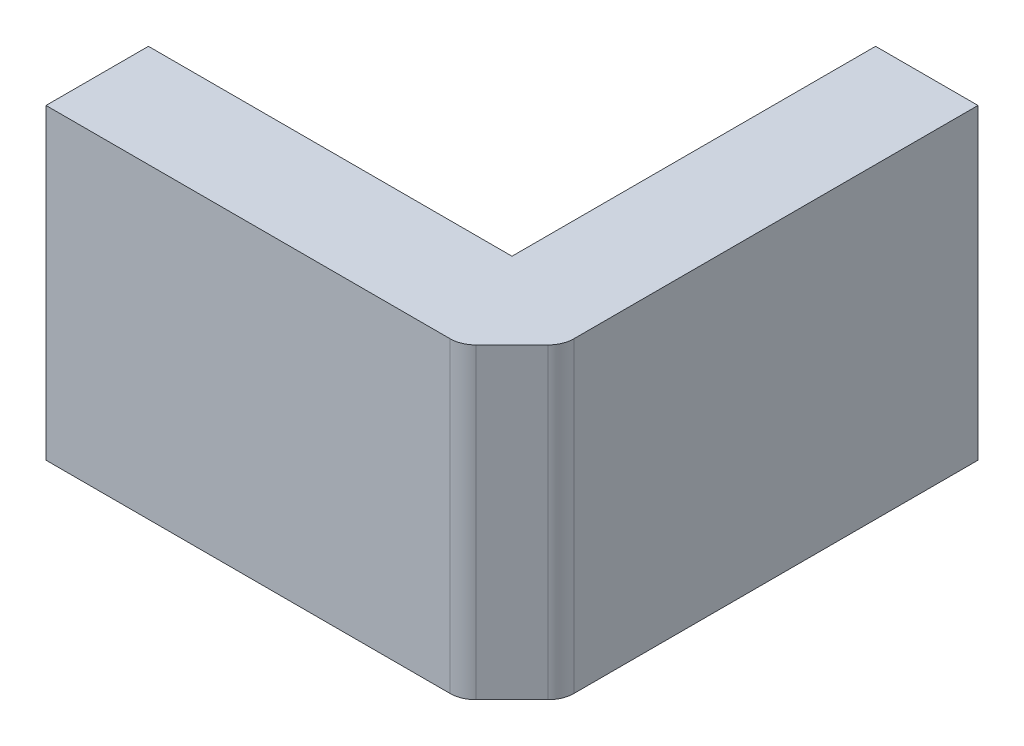
ISO-10303-21;
HEADER;
FILE_DESCRIPTION(('STEP AP214'),'2;1');
FILE_NAME('part.step','',(''),(''),'','','');
FILE_SCHEMA(('AUTOMOTIVE_DESIGN { 1 0 10303 214 1 1 1 1 }'));
ENDSEC;
DATA;
#1=APPLICATION_CONTEXT('core data for automotive mechanical design processes');
#2=APPLICATION_PROTOCOL_DEFINITION('international standard','automotive_design',2000,#1);
#3=PRODUCT_CONTEXT('',#1,'mechanical');
#4=PRODUCT('Part','Part','',(#3));
#5=PRODUCT_RELATED_PRODUCT_CATEGORY('part','',(#4));
#6=PRODUCT_DEFINITION_FORMATION('','',#4);
#7=PRODUCT_DEFINITION_CONTEXT('part definition',#1,'design');
#8=PRODUCT_DEFINITION('design','',#6,#7);
#9=PRODUCT_DEFINITION_SHAPE('','',#8);
#10=(LENGTH_UNIT() NAMED_UNIT(*) SI_UNIT(.MILLI.,.METRE.));
#11=(NAMED_UNIT(*) PLANE_ANGLE_UNIT() SI_UNIT($,.RADIAN.));
#12=(NAMED_UNIT(*) SI_UNIT($,.STERADIAN.) SOLID_ANGLE_UNIT());
#13=UNCERTAINTY_MEASURE_WITH_UNIT(LENGTH_MEASURE(1.E-05),#10,'distance_accuracy_value','');
#14=(GEOMETRIC_REPRESENTATION_CONTEXT(3) GLOBAL_UNCERTAINTY_ASSIGNED_CONTEXT((#13)) GLOBAL_UNIT_ASSIGNED_CONTEXT((#10,
#11,#12)) REPRESENTATION_CONTEXT('',''));
#15=CARTESIAN_POINT('',(0.,0.,0.));
#16=DIRECTION('',(0.,0.,1.));
#17=DIRECTION('',(1.,0.,0.));
#18=AXIS2_PLACEMENT_3D('',#15,#16,#17);
#19=CARTESIAN_POINT('',(25.5,60.,-45.5));
#20=DIRECTION('',(0.,0.,1.));
#21=DIRECTION('',(1.,0.,0.));
#22=AXIS2_PLACEMENT_3D('',#19,#20,#21);
#23=PLANE('',#22);
#24=DIRECTION('',(-1.,0.,0.));
#25=VECTOR('',#24,1.);
#26=CARTESIAN_POINT('',(25.5,0.,-45.5));
#27=LINE('',#26,#25);
#28=CARTESIAN_POINT('',(45.5,0.,-45.5));
#29=VERTEX_POINT('',#28);
#30=CARTESIAN_POINT('',(25.5,0.,-45.5));
#31=VERTEX_POINT('',#30);
#32=EDGE_CURVE('E135',#29,#31,#27,.T.);
#33=ORIENTED_EDGE('',*,*,#32,.T.);
#34=DIRECTION('',(0.,-1.,0.));
#35=VECTOR('',#34,1.);
#36=CARTESIAN_POINT('',(25.5,60.,-45.5));
#37=LINE('',#36,#35);
#38=CARTESIAN_POINT('',(25.5,60.,-45.5));
#39=VERTEX_POINT('',#38);
#40=EDGE_CURVE('E116',#39,#31,#37,.T.);
#41=ORIENTED_EDGE('',*,*,#40,.F.);
#42=DIRECTION('',(-1.,0.,0.));
#43=VECTOR('',#42,1.);
#44=CARTESIAN_POINT('',(25.5,60.,-45.5));
#45=LINE('',#44,#43);
#46=CARTESIAN_POINT('',(45.5,60.,-45.5));
#47=VERTEX_POINT('',#46);
#48=EDGE_CURVE('E123',#47,#39,#45,.T.);
#49=ORIENTED_EDGE('',*,*,#48,.F.);
#50=DIRECTION('',(0.,-1.,0.));
#51=VECTOR('',#50,1.);
#52=CARTESIAN_POINT('',(45.5,60.,-45.5));
#53=LINE('',#52,#51);
#54=EDGE_CURVE('E162',#47,#29,#53,.T.);
#55=ORIENTED_EDGE('',*,*,#54,.T.);
#56=EDGE_LOOP('',(#33,#41,#49,#55));
#57=FACE_BOUND('',#56,.T.);
#58=ADVANCED_FACE('F39',(#57),#23,.F.);
#59=CARTESIAN_POINT('',(25.5,60.,-45.5));
#60=DIRECTION('',(1.,0.,0.));
#61=DIRECTION('',(0.,0.,-1.));
#62=AXIS2_PLACEMENT_3D('',#59,#60,#61);
#63=PLANE('',#62);
#64=DIRECTION('',(0.,0.,1.));
#65=VECTOR('',#64,1.);
#66=CARTESIAN_POINT('',(25.5,0.,-45.5));
#67=LINE('',#66,#65);
#68=CARTESIAN_POINT('',(25.5,0.,25.5));
#69=VERTEX_POINT('',#68);
#70=EDGE_CURVE('E197',#31,#69,#67,.T.);
#71=ORIENTED_EDGE('',*,*,#70,.T.);
#72=DIRECTION('',(0.,-1.,0.));
#73=VECTOR('',#72,1.);
#74=CARTESIAN_POINT('',(25.5,60.,25.5));
#75=LINE('',#74,#73);
#76=CARTESIAN_POINT('',(25.5,60.,25.5));
#77=VERTEX_POINT('',#76);
#78=EDGE_CURVE('E119',#77,#69,#75,.T.);
#79=ORIENTED_EDGE('',*,*,#78,.F.);
#80=DIRECTION('',(0.,0.,1.));
#81=VECTOR('',#80,1.);
#82=CARTESIAN_POINT('',(25.5,60.,-45.5));
#83=LINE('',#82,#81);
#84=EDGE_CURVE('E112',#39,#77,#83,.T.);
#85=ORIENTED_EDGE('',*,*,#84,.F.);
#86=ORIENTED_EDGE('',*,*,#40,.T.);
#87=EDGE_LOOP('',(#71,#79,#85,#86));
#88=FACE_BOUND('',#87,.T.);
#89=ADVANCED_FACE('F114',(#88),#63,.F.);
#90=CARTESIAN_POINT('',(25.5,60.,25.5));
#91=DIRECTION('',(0.,0.,1.));
#92=DIRECTION('',(1.,0.,0.));
#93=AXIS2_PLACEMENT_3D('',#90,#91,#92);
#94=PLANE('',#93);
#95=DIRECTION('',(-1.,0.,0.));
#96=VECTOR('',#95,1.);
#97=CARTESIAN_POINT('',(25.5,0.,25.5));
#98=LINE('',#97,#96);
#99=CARTESIAN_POINT('',(-45.5,0.,25.5));
#100=VERTEX_POINT('',#99);
#101=EDGE_CURVE('E184',#69,#100,#98,.T.);
#102=ORIENTED_EDGE('',*,*,#101,.T.);
#103=DIRECTION('',(0.,-1.,0.));
#104=VECTOR('',#103,1.);
#105=CARTESIAN_POINT('',(-45.5,60.,25.5));
#106=LINE('',#105,#104);
#107=CARTESIAN_POINT('',(-45.5,60.,25.5));
#108=VERTEX_POINT('',#107);
#109=EDGE_CURVE('E141',#108,#100,#106,.T.);
#110=ORIENTED_EDGE('',*,*,#109,.F.);
#111=DIRECTION('',(-1.,0.,0.));
#112=VECTOR('',#111,1.);
#113=CARTESIAN_POINT('',(25.5,60.,25.5));
#114=LINE('',#113,#112);
#115=EDGE_CURVE('E122',#77,#108,#114,.T.);
#116=ORIENTED_EDGE('',*,*,#115,.F.);
#117=ORIENTED_EDGE('',*,*,#78,.T.);
#118=EDGE_LOOP('',(#102,#110,#116,#117));
#119=FACE_BOUND('',#118,.T.);
#120=ADVANCED_FACE('F203',(#119),#94,.F.);
#121=CARTESIAN_POINT('',(-45.5,60.,25.5));
#122=DIRECTION('',(1.,0.,0.));
#123=DIRECTION('',(0.,0.,-1.));
#124=AXIS2_PLACEMENT_3D('',#121,#122,#123);
#125=PLANE('',#124);
#126=DIRECTION('',(0.,0.,1.));
#127=VECTOR('',#126,1.);
#128=CARTESIAN_POINT('',(-45.5,0.,25.5));
#129=LINE('',#128,#127);
#130=CARTESIAN_POINT('',(-45.5,0.,45.5));
#131=VERTEX_POINT('',#130);
#132=EDGE_CURVE('E181',#100,#131,#129,.T.);
#133=ORIENTED_EDGE('',*,*,#132,.T.);
#134=DIRECTION('',(0.,-1.,0.));
#135=VECTOR('',#134,1.);
#136=CARTESIAN_POINT('',(-45.5,60.,45.5));
#137=LINE('',#136,#135);
#138=CARTESIAN_POINT('',(-45.5,60.,45.5));
#139=VERTEX_POINT('',#138);
#140=EDGE_CURVE('E180',#139,#131,#137,.T.);
#141=ORIENTED_EDGE('',*,*,#140,.F.);
#142=DIRECTION('',(0.,0.,1.));
#143=VECTOR('',#142,1.);
#144=CARTESIAN_POINT('',(-45.5,60.,25.5));
#145=LINE('',#144,#143);
#146=EDGE_CURVE('E194',#108,#139,#145,.T.);
#147=ORIENTED_EDGE('',*,*,#146,.F.);
#148=ORIENTED_EDGE('',*,*,#109,.T.);
#149=EDGE_LOOP('',(#133,#141,#147,#148));
#150=FACE_BOUND('',#149,.T.);
#151=ADVANCED_FACE('F193',(#150),#125,.F.);
#152=CARTESIAN_POINT('',(-45.5,60.,45.5));
#153=DIRECTION('',(0.,0.,-1.));
#154=DIRECTION('',(-1.,0.,0.));
#155=AXIS2_PLACEMENT_3D('',#152,#153,#154);
#156=PLANE('',#155);
#157=DIRECTION('',(1.,0.,0.));
#158=VECTOR('',#157,1.);
#159=CARTESIAN_POINT('',(-45.5,0.,45.5));
#160=LINE('',#159,#158);
#161=CARTESIAN_POINT('',(33.4289321881345,0.,45.5));
#162=VERTEX_POINT('',#161);
#163=EDGE_CURVE('E173',#131,#162,#160,.T.);
#164=ORIENTED_EDGE('',*,*,#163,.T.);
#165=DIRECTION('',(0.,-1.,0.));
#166=VECTOR('',#165,1.);
#167=CARTESIAN_POINT('',(33.4289321881345,60.,45.5));
#168=LINE('',#167,#166);
#169=CARTESIAN_POINT('',(33.4289321881345,60.,45.5));
#170=VERTEX_POINT('',#169);
#171=EDGE_CURVE('E11',#162,#170,#168,.F.);
#172=ORIENTED_EDGE('',*,*,#171,.T.);
#173=DIRECTION('',(1.,0.,0.));
#174=VECTOR('',#173,1.);
#175=CARTESIAN_POINT('',(-45.5,60.,45.5));
#176=LINE('',#175,#174);
#177=EDGE_CURVE('E163',#139,#170,#176,.T.);
#178=ORIENTED_EDGE('',*,*,#177,.F.);
#179=ORIENTED_EDGE('',*,*,#140,.T.);
#180=EDGE_LOOP('',(#164,#172,#178,#179));
#181=FACE_BOUND('',#180,.T.);
#182=ADVANCED_FACE('F176',(#181),#156,.F.);
#183=CARTESIAN_POINT('',(45.5,60.,45.5));
#184=DIRECTION('',(-1.,0.,0.));
#185=DIRECTION('',(0.,0.,1.));
#186=AXIS2_PLACEMENT_3D('',#183,#184,#185);
#187=PLANE('',#186);
#188=DIRECTION('',(0.,0.,-1.));
#189=VECTOR('',#188,1.);
#190=CARTESIAN_POINT('',(45.5,60.,45.5));
#191=LINE('',#190,#189);
#192=CARTESIAN_POINT('',(45.5,60.,33.4289321881345));
#193=VERTEX_POINT('',#192);
#194=EDGE_CURVE('E128',#193,#47,#191,.T.);
#195=ORIENTED_EDGE('',*,*,#194,.F.);
#196=DIRECTION('',(0.,1.,0.));
#197=VECTOR('',#196,1.);
#198=CARTESIAN_POINT('',(45.5,0.,33.4289321881345));
#199=LINE('',#198,#197);
#200=CARTESIAN_POINT('',(45.5,0.,33.4289321881345));
#201=VERTEX_POINT('',#200);
#202=EDGE_CURVE('E146',#193,#201,#199,.F.);
#203=ORIENTED_EDGE('',*,*,#202,.T.);
#204=DIRECTION('',(0.,0.,-1.));
#205=VECTOR('',#204,1.);
#206=CARTESIAN_POINT('',(45.5,0.,45.5));
#207=LINE('',#206,#205);
#208=EDGE_CURVE('E132',#201,#29,#207,.T.);
#209=ORIENTED_EDGE('',*,*,#208,.T.);
#210=ORIENTED_EDGE('',*,*,#54,.F.);
#211=EDGE_LOOP('',(#195,#203,#209,#210));
#212=FACE_BOUND('',#211,.T.);
#213=ADVANCED_FACE('F160',(#212),#187,.F.);
#214=CARTESIAN_POINT('',(0.,60.,0.));
#215=DIRECTION('',(0.,1.,0.));
#216=DIRECTION('',(0.,0.,1.));
#217=AXIS2_PLACEMENT_3D('',#214,#215,#216);
#218=PLANE('',#217);
#219=DIRECTION('',(-0.707106781186549,0.,0.707106781186546));
#220=VECTOR('',#219,1.);
#221=CARTESIAN_POINT('',(40.4999999999999,60.,40.5000000000001));
#222=LINE('',#221,#220);
#223=CARTESIAN_POINT('',(36.9644660940672,60.,44.0355339059327));
#224=VERTEX_POINT('',#223);
#225=CARTESIAN_POINT('',(44.0355339059327,60.,36.9644660940672));
#226=VERTEX_POINT('',#225);
#227=EDGE_CURVE('E139',#224,#226,#222,.F.);
#228=ORIENTED_EDGE('',*,*,#227,.T.);
#229=CARTESIAN_POINT('',(40.5,60.,33.4289321881345));
#230=DIRECTION('',(0.,1.,0.));
#231=DIRECTION('',(0.,0.,1.));
#232=AXIS2_PLACEMENT_3D('',#229,#230,#231);
#233=CIRCLE('',#232,5.);
#234=EDGE_CURVE('E47',#226,#193,#233,.T.);
#235=ORIENTED_EDGE('',*,*,#234,.T.);
#236=ORIENTED_EDGE('',*,*,#194,.T.);
#237=ORIENTED_EDGE('',*,*,#48,.T.);
#238=ORIENTED_EDGE('',*,*,#84,.T.);
#239=ORIENTED_EDGE('',*,*,#115,.T.);
#240=ORIENTED_EDGE('',*,*,#146,.T.);
#241=ORIENTED_EDGE('',*,*,#177,.T.);
#242=CARTESIAN_POINT('',(33.4289321881345,60.,40.5));
#243=DIRECTION('',(0.,1.,0.));
#244=DIRECTION('',(0.,0.,1.));
#245=AXIS2_PLACEMENT_3D('',#242,#243,#244);
#246=CIRCLE('',#245,5.);
#247=EDGE_CURVE('E54',#170,#224,#246,.T.);
#248=ORIENTED_EDGE('',*,*,#247,.T.);
#249=EDGE_LOOP('',(#228,#235,#236,#237,#238,#239,#240,#241,#248));
#250=FACE_BOUND('',#249,.T.);
#251=ADVANCED_FACE('F126',(#250),#218,.T.);
#252=CARTESIAN_POINT('',(0.,0.,0.));
#253=DIRECTION('',(0.,1.,0.));
#254=DIRECTION('',(0.,0.,1.));
#255=AXIS2_PLACEMENT_3D('',#252,#253,#254);
#256=PLANE('',#255);
#257=ORIENTED_EDGE('',*,*,#208,.F.);
#258=CARTESIAN_POINT('',(40.5,0.,33.4289321881345));
#259=DIRECTION('',(0.,1.,0.));
#260=DIRECTION('',(0.,0.,1.));
#261=AXIS2_PLACEMENT_3D('',#258,#259,#260);
#262=CIRCLE('',#261,5.);
#263=CARTESIAN_POINT('',(44.0355339059327,0.,36.9644660940672));
#264=VERTEX_POINT('',#263);
#265=EDGE_CURVE('E151',#201,#264,#262,.F.);
#266=ORIENTED_EDGE('',*,*,#265,.T.);
#267=DIRECTION('',(0.707106781186549,0.,-0.707106781186546));
#268=VECTOR('',#267,1.);
#269=CARTESIAN_POINT('',(45.5,0.,35.5));
#270=LINE('',#269,#268);
#271=CARTESIAN_POINT('',(36.9644660940672,0.,44.0355339059327));
#272=VERTEX_POINT('',#271);
#273=EDGE_CURVE('E136',#264,#272,#270,.F.);
#274=ORIENTED_EDGE('',*,*,#273,.T.);
#275=CARTESIAN_POINT('',(33.4289321881345,0.,40.5));
#276=DIRECTION('',(0.,1.,0.));
#277=DIRECTION('',(0.,0.,1.));
#278=AXIS2_PLACEMENT_3D('',#275,#276,#277);
#279=CIRCLE('',#278,5.);
#280=EDGE_CURVE('E149',#272,#162,#279,.F.);
#281=ORIENTED_EDGE('',*,*,#280,.T.);
#282=ORIENTED_EDGE('',*,*,#163,.F.);
#283=ORIENTED_EDGE('',*,*,#132,.F.);
#284=ORIENTED_EDGE('',*,*,#101,.F.);
#285=ORIENTED_EDGE('',*,*,#70,.F.);
#286=ORIENTED_EDGE('',*,*,#32,.F.);
#287=EDGE_LOOP('',(#257,#266,#274,#281,#282,#283,#284,#285,#286));
#288=FACE_BOUND('',#287,.T.);
#289=ADVANCED_FACE('F167',(#288),#256,.F.);
#290=CARTESIAN_POINT('',(45.5,60.,35.5));
#291=DIRECTION('',(-0.707106781186546,0.,-0.707106781186549));
#292=DIRECTION('',(0.,-1.,0.));
#293=AXIS2_PLACEMENT_3D('',#290,#291,#292);
#294=PLANE('',#293);
#295=ORIENTED_EDGE('',*,*,#273,.F.);
#296=DIRECTION('',(0.,-1.,0.));
#297=VECTOR('',#296,1.);
#298=CARTESIAN_POINT('',(44.0355339059327,60.,36.9644660940672));
#299=LINE('',#298,#297);
#300=EDGE_CURVE('E61',#264,#226,#299,.F.);
#301=ORIENTED_EDGE('',*,*,#300,.T.);
#302=ORIENTED_EDGE('',*,*,#227,.F.);
#303=DIRECTION('',(0.,1.,0.));
#304=VECTOR('',#303,1.);
#305=CARTESIAN_POINT('',(36.9644660940672,0.,44.0355339059327));
#306=LINE('',#305,#304);
#307=EDGE_CURVE('E153',#224,#272,#306,.F.);
#308=ORIENTED_EDGE('',*,*,#307,.T.);
#309=EDGE_LOOP('',(#295,#301,#302,#308));
#310=FACE_BOUND('',#309,.T.);
#311=ADVANCED_FACE('F169',(#310),#294,.F.);
#312=CARTESIAN_POINT('',(40.5,60.,33.4289321881345));
#313=DIRECTION('',(0.,-1.,0.));
#314=DIRECTION('',(0.,0.,-1.));
#315=AXIS2_PLACEMENT_3D('',#312,#313,#314);
#316=CYLINDRICAL_SURFACE('',#315,5.);
#317=ORIENTED_EDGE('',*,*,#234,.F.);
#318=ORIENTED_EDGE('',*,*,#300,.F.);
#319=ORIENTED_EDGE('',*,*,#265,.F.);
#320=ORIENTED_EDGE('',*,*,#202,.F.);
#321=EDGE_LOOP('',(#317,#318,#319,#320));
#322=FACE_BOUND('',#321,.T.);
#323=ADVANCED_FACE('F165',(#322),#316,.T.);
#324=CARTESIAN_POINT('',(33.4289321881345,60.,40.5));
#325=DIRECTION('',(0.,1.,0.));
#326=DIRECTION('',(0.,0.,1.));
#327=AXIS2_PLACEMENT_3D('',#324,#325,#326);
#328=CYLINDRICAL_SURFACE('',#327,5.);
#329=ORIENTED_EDGE('',*,*,#280,.F.);
#330=ORIENTED_EDGE('',*,*,#307,.F.);
#331=ORIENTED_EDGE('',*,*,#247,.F.);
#332=ORIENTED_EDGE('',*,*,#171,.F.);
#333=EDGE_LOOP('',(#329,#330,#331,#332));
#334=FACE_BOUND('',#333,.T.);
#335=ADVANCED_FACE('F41',(#334),#328,.T.);
#336=CLOSED_SHELL('',(#58,#89,#120,#151,#182,#213,#251,#289,#311,#323,#335));
#337=MANIFOLD_SOLID_BREP('B2',#336);
#338=ADVANCED_BREP_SHAPE_REPRESENTATION('',(#18,#337),#14);
#339=SHAPE_DEFINITION_REPRESENTATION(#9,#338);
ENDSEC;
END-ISO-10303-21;
